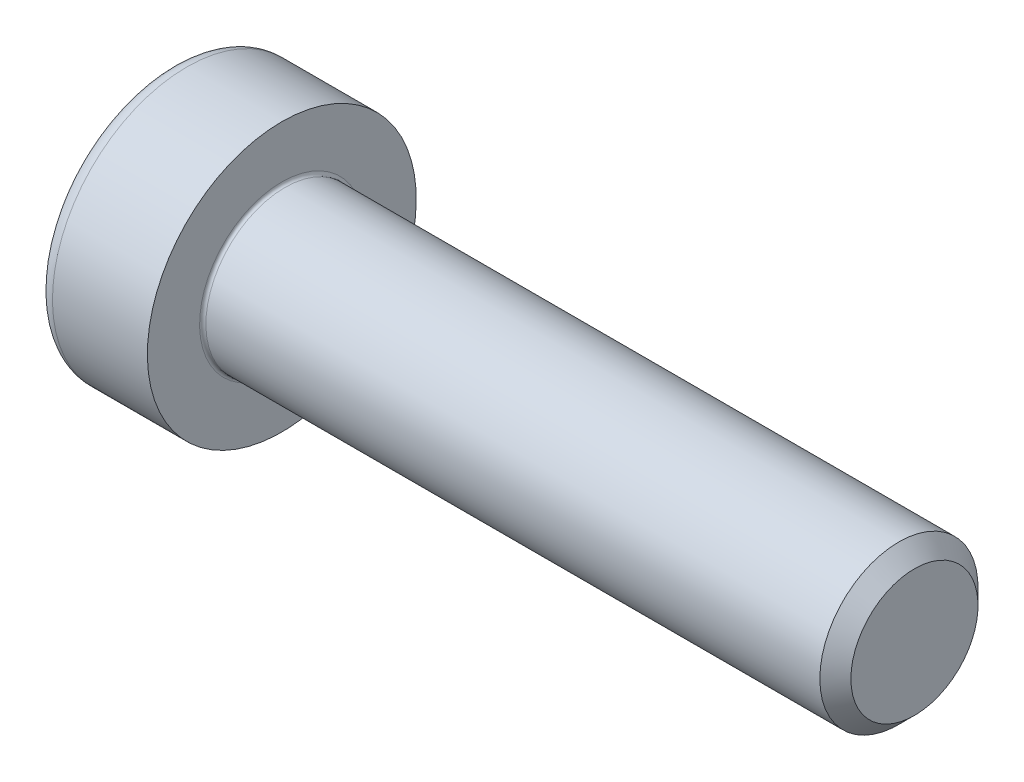
ISO-10303-21;
HEADER;
FILE_DESCRIPTION(('STEP AP214'),'2;1');
FILE_NAME('part.step','',(''),(''),'','','');
FILE_SCHEMA(('AUTOMOTIVE_DESIGN { 1 0 10303 214 1 1 1 1 }'));
ENDSEC;
DATA;
#1=APPLICATION_CONTEXT('core data for automotive mechanical design processes');
#2=APPLICATION_PROTOCOL_DEFINITION('international standard','automotive_design',2000,#1);
#3=PRODUCT_CONTEXT('',#1,'mechanical');
#4=PRODUCT('Part','Part','',(#3));
#5=PRODUCT_RELATED_PRODUCT_CATEGORY('part','',(#4));
#6=PRODUCT_DEFINITION_FORMATION('','',#4);
#7=PRODUCT_DEFINITION_CONTEXT('part definition',#1,'design');
#8=PRODUCT_DEFINITION('design','',#6,#7);
#9=PRODUCT_DEFINITION_SHAPE('','',#8);
#10=(LENGTH_UNIT() NAMED_UNIT(*) SI_UNIT(.MILLI.,.METRE.));
#11=(NAMED_UNIT(*) PLANE_ANGLE_UNIT() SI_UNIT($,.RADIAN.));
#12=(NAMED_UNIT(*) SI_UNIT($,.STERADIAN.) SOLID_ANGLE_UNIT());
#13=UNCERTAINTY_MEASURE_WITH_UNIT(LENGTH_MEASURE(1.E-05),#10,'distance_accuracy_value','');
#14=(GEOMETRIC_REPRESENTATION_CONTEXT(3) GLOBAL_UNCERTAINTY_ASSIGNED_CONTEXT((#13)) GLOBAL_UNIT_ASSIGNED_CONTEXT((#10,
#11,#12)) REPRESENTATION_CONTEXT('',''));
#15=CARTESIAN_POINT('',(0.,0.,0.));
#16=DIRECTION('',(0.,0.,1.));
#17=DIRECTION('',(1.,0.,0.));
#18=AXIS2_PLACEMENT_3D('',#15,#16,#17);
#19=CARTESIAN_POINT('',(-3.5,-1.5,0.866025403784439));
#20=DIRECTION('',(0.,-0.5,0.866025403784439));
#21=DIRECTION('',(0.,-0.866025403784439,-0.5));
#22=AXIS2_PLACEMENT_3D('',#19,#20,#21);
#23=PLANE('',#22);
#24=DIRECTION('',(1.,0.,0.));
#25=VECTOR('',#24,1.);
#26=CARTESIAN_POINT('',(-3.5,-1.5,0.866025403784439));
#27=LINE('',#26,#25);
#28=CARTESIAN_POINT('',(-0.799999985622492,-1.49999995696418,0.866025428631178));
#29=VERTEX_POINT('',#28);
#30=CARTESIAN_POINT('',(-3.5,-1.5,0.866025403784439));
#31=VERTEX_POINT('',#30);
#32=EDGE_CURVE('E80',#29,#31,#27,.F.);
#33=ORIENTED_EDGE('',*,*,#32,.T.);
#34=DIRECTION('',(0.,-0.866025403784439,-0.5));
#35=VECTOR('',#34,1.);
#36=CARTESIAN_POINT('',(-3.5,-1.5,0.866025403784439));
#37=LINE('',#36,#35);
#38=CARTESIAN_POINT('',(-3.5,0.,1.73205080756888));
#39=VERTEX_POINT('',#38);
#40=EDGE_CURVE('E92',#39,#31,#37,.T.);
#41=ORIENTED_EDGE('',*,*,#40,.F.);
#42=DIRECTION('',(1.,0.,0.));
#43=VECTOR('',#42,1.);
#44=CARTESIAN_POINT('',(-3.5,0.,1.73205080756888));
#45=LINE('',#44,#43);
#46=CARTESIAN_POINT('',(-0.799999997599108,7.10597104829765E-09,1.73205080346625));
#47=VERTEX_POINT('',#46);
#48=EDGE_CURVE('E75',#39,#47,#45,.T.);
#49=ORIENTED_EDGE('',*,*,#48,.T.);
#50=CARTESIAN_POINT('',(-0.79999999523045,-1.42119406428362E-08,1.73205079936361));
#51=CARTESIAN_POINT('',(-0.778021654471843,-0.0659159296217296,1.69399422785789));
#52=CARTESIAN_POINT('',(-0.75803350387137,-0.132400830276049,1.65560915256807));
#53=CARTESIAN_POINT('',(-0.723144787463201,-0.266521773143787,1.57817439009942));
#54=CARTESIAN_POINT('',(-0.708256562613242,-0.334160197650871,1.53912332750269));
#55=CARTESIAN_POINT('',(-0.685081967437947,-0.468598837632643,1.46150514251973));
#56=CARTESIAN_POINT('',(-0.676641339355386,-0.535378373795379,1.42294995933981));
#57=CARTESIAN_POINT('',(-0.666566875590512,-0.669251501943533,1.34565827276622));
#58=CARTESIAN_POINT('',(-0.664924695379553,-0.736344607670476,1.306922050114));
#59=CARTESIAN_POINT('',(-0.668349717996245,-0.861700870345308,1.23454757811408));
#60=CARTESIAN_POINT('',(-0.672575963675141,-0.919982838042977,1.20089846837493));
#61=CARTESIAN_POINT('',(-0.685967972738458,-1.03616708549267,1.13381946183425));
#62=CARTESIAN_POINT('',(-0.69513830632732,-1.09406896369459,1.10038979686779));
#63=CARTESIAN_POINT('',(-0.718062365210631,-1.21049256160527,1.03317260127403));
#64=CARTESIAN_POINT('',(-0.731913218734013,-1.26899955377542,0.999393573595124));
#65=CARTESIAN_POINT('',(-0.763348800641441,-1.38514115888167,0.932339186622913));
#66=CARTESIAN_POINT('',(-0.780926147658833,-1.44277725857737,0.899062968948563));
#67=CARTESIAN_POINT('',(-0.799999971939572,-1.49999991591542,0.866025452330692));
#68=B_SPLINE_CURVE_WITH_KNOTS('',3,(#50,#51,#52,#53,#54,#55,#56,#57,#58,#59,#60,#61,#62,#63,#64,
#65,#66,#67),.UNSPECIFIED.,.F.,.F.,(4,2,2,2,2,2,2,2,4),(0.,0.237762007462697,0.476095360319202,
0.708530701230582,0.940680662376141,1.14278080497742,1.34506808554704,1.5518411278147,
1.75820836205007),.UNSPECIFIED.);
#69=EDGE_CURVE('E20',#47,#29,#68,.T.);
#70=ORIENTED_EDGE('',*,*,#69,.T.);
#71=EDGE_LOOP('',(#33,#41,#49,#70));
#72=FACE_BOUND('',#71,.T.);
#73=ADVANCED_FACE('F16',(#72),#23,.F.);
#74=CARTESIAN_POINT('',(-3.5,-1.5,-0.866025403784438));
#75=DIRECTION('',(0.,-1.,0.));
#76=DIRECTION('',(0.,0.,-1.));
#77=AXIS2_PLACEMENT_3D('',#74,#75,#76);
#78=PLANE('',#77);
#79=DIRECTION('',(1.,0.,0.));
#80=VECTOR('',#79,1.);
#81=CARTESIAN_POINT('',(-3.5,-1.5,-0.866025403784441));
#82=LINE('',#81,#80);
#83=CARTESIAN_POINT('',(-0.799999985618856,-1.5,-0.866025354078363));
#84=VERTEX_POINT('',#83);
#85=CARTESIAN_POINT('',(-3.5,-1.5,-0.86602540378444));
#86=VERTEX_POINT('',#85);
#87=EDGE_CURVE('E256',#84,#86,#82,.F.);
#88=ORIENTED_EDGE('',*,*,#87,.T.);
#89=DIRECTION('',(0.,0.,-1.));
#90=VECTOR('',#89,1.);
#91=CARTESIAN_POINT('',(-3.5,-1.5,-0.866025403784438));
#92=LINE('',#91,#90);
#93=EDGE_CURVE('E91',#31,#86,#92,.T.);
#94=ORIENTED_EDGE('',*,*,#93,.F.);
#95=ORIENTED_EDGE('',*,*,#32,.F.);
#96=CARTESIAN_POINT('',(-0.80000001920407,-1.5,0.866025470420961));
#97=CARTESIAN_POINT('',(-0.77802167648407,-1.5,0.789912326035068));
#98=CARTESIAN_POINT('',(-0.758033523798478,-1.5,0.71314217407231));
#99=CARTESIAN_POINT('',(-0.72314480305895,-1.5,0.558272646234354));
#100=CARTESIAN_POINT('',(-0.708256575965243,-1.5,0.480170519522534));
#101=CARTESIAN_POINT('',(-0.685081976339449,-1.5,0.324934146522609));
#102=CARTESIAN_POINT('',(-0.676641346041333,-1.5,0.247823778652587));
#103=CARTESIAN_POINT('',(-0.666566877999529,-1.5,0.093240402308305));
#104=CARTESIAN_POINT('',(-0.664924695725613,-1.5,0.0157679553172992));
#105=CARTESIAN_POINT('',(-0.668349714916898,-1.5,-0.128980995732178));
#106=CARTESIAN_POINT('',(-0.672575959480538,-1.5,-0.1962792205453));
#107=CARTESIAN_POINT('',(-0.685967967205766,-1.5,-0.330437244313667));
#108=CARTESIAN_POINT('',(-0.695138300573747,-1.5,-0.39729657959867));
#109=CARTESIAN_POINT('',(-0.718062359838272,-1.5,-0.531730981680734));
#110=CARTESIAN_POINT('',(-0.731913213992538,-1.5,-0.599289042577003));
#111=CARTESIAN_POINT('',(-0.763348797820156,-1.5,-0.733397827427737));
#112=CARTESIAN_POINT('',(-0.780926146124214,-1.5,-0.799950268144878));
#113=CARTESIAN_POINT('',(-0.799999971931643,-1.5,-0.866025306664466));
#114=B_SPLINE_CURVE_WITH_KNOTS('',3,(#96,#97,#98,#99,#100,#101,#102,#103,#104,#105,#106,#107,
#108,#109,#110,#111,#112,#113),.UNSPECIFIED.,.F.,.F.,(4,2,2,2,2,2,2,2,4),(0.,0.237762013064718,
0.476095371668162,0.708530717807786,0.940680684127374,1.14278084243753,1.34506813877668,
1.55184119766869,1.75820844842222),.UNSPECIFIED.);
#115=EDGE_CURVE('E85',#29,#84,#114,.T.);
#116=ORIENTED_EDGE('',*,*,#115,.T.);
#117=EDGE_LOOP('',(#88,#94,#95,#116));
#118=FACE_BOUND('',#117,.T.);
#119=ADVANCED_FACE('F89',(#118),#78,.F.);
#120=CARTESIAN_POINT('',(-3.5,0.,1.73205080756888));
#121=DIRECTION('',(0.,0.500000000000001,0.866025403784438));
#122=DIRECTION('',(0.,-0.866025403784438,0.500000000000001));
#123=AXIS2_PLACEMENT_3D('',#120,#121,#122);
#124=PLANE('',#123);
#125=ORIENTED_EDGE('',*,*,#48,.F.);
#126=DIRECTION('',(0.,-0.866025403784438,0.500000000000001));
#127=VECTOR('',#126,1.);
#128=CARTESIAN_POINT('',(-3.5,0.,1.73205080756888));
#129=LINE('',#128,#127);
#130=CARTESIAN_POINT('',(-3.5,1.5,0.866025403784438));
#131=VERTEX_POINT('',#130);
#132=EDGE_CURVE('E264',#131,#39,#129,.T.);
#133=ORIENTED_EDGE('',*,*,#132,.F.);
#134=DIRECTION('',(1.,0.,0.));
#135=VECTOR('',#134,1.);
#136=CARTESIAN_POINT('',(-3.5,1.5,0.866025403784437));
#137=LINE('',#136,#135);
#138=CARTESIAN_POINT('',(-0.799999985618081,1.5,0.86602535407568));
#139=VERTEX_POINT('',#138);
#140=EDGE_CURVE('E86',#131,#139,#137,.T.);
#141=ORIENTED_EDGE('',*,*,#140,.T.);
#142=CARTESIAN_POINT('',(-0.800000019200306,1.50000005769763,0.866025370472699));
#143=CARTESIAN_POINT('',(-0.778021676473136,1.434084141075,0.904081942678651));
#144=CARTESIAN_POINT('',(-0.758033523781653,1.36759923920006,0.942467018673197));
#145=CARTESIAN_POINT('',(-0.723144803033518,1.23347829377109,1.01990178262058));
#146=CARTESIAN_POINT('',(-0.708256575937328,1.16583986792264,1.05895284599175));
#147=CARTESIAN_POINT('',(-0.685081976321015,1.03140122530974,1.13657103249379));
#148=CARTESIAN_POINT('',(-0.676641346030252,0.96462168786259,1.17512621641526));
#149=CARTESIAN_POINT('',(-0.666566877997534,0.830748556996803,1.25241790455788));
#150=CARTESIAN_POINT('',(-0.664924695725133,0.763655449836942,1.2911541280374));
#151=CARTESIAN_POINT('',(-0.668349715079621,0.638299175179464,1.3635286069555));
#152=CARTESIAN_POINT('',(-0.672575960339688,0.580017196969192,1.3971777227641));
#153=CARTESIAN_POINT('',(-0.685967970415505,0.463832928577172,1.46425674139584));
#154=CARTESIAN_POINT('',(-0.695138305439918,0.405931039945865,1.49768641238371));
#155=CARTESIAN_POINT('',(-0.718062368834513,0.289507420877407,1.56490362019291));
#156=CARTESIAN_POINT('',(-0.731913225492328,0.231000417988109,1.59868265406053));
#157=CARTESIAN_POINT('',(-0.763348814871443,0.114858791806787,1.66573705320044));
#158=CARTESIAN_POINT('',(-0.780926166220136,0.0572226817538924,1.69901327685452));
#159=CARTESIAN_POINT('',(-0.799999995230451,1.4211942059671E-08,1.73205079936361));
#160=B_SPLINE_CURVE_WITH_KNOTS('',3,(#142,#143,#144,#145,#146,#147,#148,#149,#150,#151,#152,
#153,#154,#155,#156,#157,#158,#159),.UNSPECIFIED.,.F.,.F.,(4,2,2,2,2,2,2,2,4),(0.,
0.237762013145497,0.476095371840186,0.708530717895911,0.940680684123999,1.14278086287541,
1.34506817973146,1.55184126020577,1.75820853237728),.UNSPECIFIED.);
#161=EDGE_CURVE('E124',#139,#47,#160,.T.);
#162=ORIENTED_EDGE('',*,*,#161,.T.);
#163=EDGE_LOOP('',(#125,#133,#141,#162));
#164=FACE_BOUND('',#163,.T.);
#165=ADVANCED_FACE('F117',(#164),#124,.F.);
#166=CARTESIAN_POINT('',(-3.5,0.,-1.73205080756888));
#167=DIRECTION('',(0.,-0.5,-0.866025403784439));
#168=DIRECTION('',(0.,0.866025403784439,-0.5));
#169=AXIS2_PLACEMENT_3D('',#166,#167,#168);
#170=PLANE('',#169);
#171=DIRECTION('',(1.,0.,0.));
#172=VECTOR('',#171,1.);
#173=CARTESIAN_POINT('',(-3.5,0.,-1.73205080756888));
#174=LINE('',#173,#172);
#175=CARTESIAN_POINT('',(-0.79999999228092,-5.19199616255216E-08,-1.73205079425487));
#176=VERTEX_POINT('',#175);
#177=CARTESIAN_POINT('',(-3.5,0.,-1.73205080756888));
#178=VERTEX_POINT('',#177);
#179=EDGE_CURVE('E130',#176,#178,#174,.F.);
#180=ORIENTED_EDGE('',*,*,#179,.T.);
#181=DIRECTION('',(0.,0.866025403784439,-0.5));
#182=VECTOR('',#181,1.);
#183=CARTESIAN_POINT('',(-3.5,0.,-1.73205080756888));
#184=LINE('',#183,#182);
#185=EDGE_CURVE('E40',#86,#178,#184,.T.);
#186=ORIENTED_EDGE('',*,*,#185,.F.);
#187=ORIENTED_EDGE('',*,*,#87,.F.);
#188=CARTESIAN_POINT('',(-0.80000001919876,-1.50000005769299,-0.866025370475382));
#189=CARTESIAN_POINT('',(-0.778021676478217,-1.43408414109019,-0.904081942669888));
#190=CARTESIAN_POINT('',(-0.758033523792275,-1.36759923923531,-0.942467018652848));
#191=CARTESIAN_POINT('',(-0.723144803052494,-1.23347829384962,-1.01990178257524));
#192=CARTESIAN_POINT('',(-0.708256575958914,-1.1658398680244,-1.05895284593299));
#193=CARTESIAN_POINT('',(-0.685081976335253,-1.03140122541517,-1.13657103243292));
#194=CARTESIAN_POINT('',(-0.676641346038543,-0.964621687947892,-1.17512621636601));
#195=CARTESIAN_POINT('',(-0.666566877998786,-0.830748557038207,-1.25241790453398));
#196=CARTESIAN_POINT('',(-0.664924695725483,-0.763655449854563,-1.29115412802722));
#197=CARTESIAN_POINT('',(-0.668349714938769,-0.638299180308243,-1.3635286039944));
#198=CARTESIAN_POINT('',(-0.672575959593581,-0.580017207221899,-1.3971777168447));
#199=CARTESIAN_POINT('',(-0.685967967626045,-0.463832948992601,-1.46425672960898));
#200=CARTESIAN_POINT('',(-0.695138301210387,-0.405931065399885,-1.49768639768783));
#201=CARTESIAN_POINT('',(-0.718062361014188,-0.289507456525241,-1.56490359961163));
#202=CARTESIAN_POINT('',(-0.731913215495269,-0.231000458786164,-1.59868263050576));
#203=CARTESIAN_POINT('',(-0.763348800047481,-0.114858842717895,-1.66573702380689));
#204=CARTESIAN_POINT('',(-0.780926148748883,-0.0572227376285118,-1.69901324459529));
#205=CARTESIAN_POINT('',(-0.799999974974276,-7.49804696541984E-08,-1.73205076427889));
#206=B_SPLINE_CURVE_WITH_KNOTS('',3,(#188,#189,#190,#191,#192,#193,#194,#195,#196,#197,#198,
#199,#200,#201,#202,#203,#204,#205),.UNSPECIFIED.,.F.,.F.,(4,2,2,2,2,2,2,2,4),(0.,
0.237762013074141,0.476095371688346,0.708530717815962,0.940680684122561,1.14278084509901,
1.34506814411433,1.55184120582146,1.75820845936868),.UNSPECIFIED.);
#207=EDGE_CURVE('E98',#84,#176,#206,.T.);
#208=ORIENTED_EDGE('',*,*,#207,.T.);
#209=EDGE_LOOP('',(#180,#186,#187,#208));
#210=FACE_BOUND('',#209,.T.);
#211=ADVANCED_FACE('F120',(#210),#170,.F.);
#212=CARTESIAN_POINT('',(-3.5,1.5,0.866025403784437));
#213=DIRECTION('',(0.,1.,0.));
#214=DIRECTION('',(0.,0.,1.));
#215=AXIS2_PLACEMENT_3D('',#212,#213,#214);
#216=PLANE('',#215);
#217=ORIENTED_EDGE('',*,*,#140,.F.);
#218=DIRECTION('',(0.,0.,1.));
#219=VECTOR('',#218,1.);
#220=CARTESIAN_POINT('',(-3.5,1.5,0.866025403784437));
#221=LINE('',#220,#219);
#222=CARTESIAN_POINT('',(-3.5,1.5,-0.86602540378444));
#223=VERTEX_POINT('',#222);
#224=EDGE_CURVE('E246',#223,#131,#221,.T.);
#225=ORIENTED_EDGE('',*,*,#224,.F.);
#226=DIRECTION('',(1.,0.,0.));
#227=VECTOR('',#226,1.);
#228=CARTESIAN_POINT('',(-3.5,1.5,-0.86602540378444));
#229=LINE('',#228,#227);
#230=CARTESIAN_POINT('',(-0.800000004773855,1.5,-0.866025420433232));
#231=VERTEX_POINT('',#230);
#232=EDGE_CURVE('E233',#223,#231,#229,.T.);
#233=ORIENTED_EDGE('',*,*,#232,.T.);
#234=CARTESIAN_POINT('',(-0.800000009579947,1.5,-0.866025437082024));
#235=CARTESIAN_POINT('',(-0.778021667647342,1.5,-0.789912293247904));
#236=CARTESIAN_POINT('',(-0.758033515798816,1.5,-0.713142141840401));
#237=CARTESIAN_POINT('',(-0.723144796798097,1.5,-0.558272615166911));
#238=CARTESIAN_POINT('',(-0.708256570605135,1.5,-0.480170489064639));
#239=CARTESIAN_POINT('',(-0.685081972765976,1.5,-0.324934117282703));
#240=CARTESIAN_POINT('',(-0.676641343357286,1.5,-0.247823750018937));
#241=CARTESIAN_POINT('',(-0.666566877032438,1.5,-0.0932403749581056));
#242=CARTESIAN_POINT('',(-0.664924695586688,1.5,-0.0157679286441603));
#243=CARTESIAN_POINT('',(-0.668349716153057,1.5,0.12898101957391));
#244=CARTESIAN_POINT('',(-0.672575961164274,1.5,0.196279242244028));
#245=CARTESIAN_POINT('',(-0.685967969426204,1.5,0.330437261719437));
#246=CARTESIAN_POINT('',(-0.695138302882526,1.5,0.397296594854532));
#247=CARTESIAN_POINT('',(-0.718062361993189,1.5,0.531730992560314));
#248=CARTESIAN_POINT('',(-0.731913215893689,1.5,0.599289051231826));
#249=CARTESIAN_POINT('',(-0.763348798949344,1.5,0.733397831701578));
#250=CARTESIAN_POINT('',(-0.780926146736267,1.5,0.799950270262262));
#251=CARTESIAN_POINT('',(-0.799999971930172,1.5,0.866025306659371));
#252=B_SPLINE_CURVE_WITH_KNOTS('',3,(#234,#235,#236,#237,#238,#239,#240,#241,#242,#243,#244,
#245,#246,#247,#248,#249,#250,#251),.UNSPECIFIED.,.F.,.F.,(4,2,2,2,2,2,2,2,4),(0.,
0.237762010815791,0.476095367112129,0.708530711152909,0.94068067539542,1.14278082739522,
1.34506811739966,1.55184116961357,1.75820841373167),.UNSPECIFIED.);
#253=EDGE_CURVE('E99',#231,#139,#252,.T.);
#254=ORIENTED_EDGE('',*,*,#253,.T.);
#255=EDGE_LOOP('',(#217,#225,#233,#254));
#256=FACE_BOUND('',#255,.T.);
#257=ADVANCED_FACE('F142',(#256),#216,.F.);
#258=CARTESIAN_POINT('',(-0.805999999954565,0.,0.));
#259=DIRECTION('',(-1.,0.,0.));
#260=DIRECTION('',(0.,0.,1.));
#261=AXIS2_PLACEMENT_3D('',#258,#259,#260);
#262=CONICAL_SURFACE('',#261,1.74244311239136,1.04719755119347);
#263=CARTESIAN_POINT('',(0.200000000006639,5.6843418860808E-11,0.));
#264=VERTEX_POINT('',#263);
#265=VERTEX_LOOP('',#264);
#266=FACE_BOUND('',#265,.T.);
#267=ORIENTED_EDGE('',*,*,#253,.F.);
#268=CARTESIAN_POINT('',(-0.799999987565332,1.49999999829359,-0.866025421405676));
#269=CARTESIAN_POINT('',(-0.778021652564251,1.43408407762085,-0.904081985288844));
#270=CARTESIAN_POINT('',(-0.758033504356687,1.3675991751805,-0.942467057236285));
#271=CARTESIAN_POINT('',(-0.723144789665911,1.23347823172278,-1.01990181683896));
#272=CARTESIAN_POINT('',(-0.708256564139788,1.16583980841784,-1.0589528799219));
#273=CARTESIAN_POINT('',(-0.685081968277446,1.03140116995321,-1.13657106486834));
#274=CARTESIAN_POINT('',(-0.676641340171225,0.964621634125293,-1.17512624755098));
#275=CARTESIAN_POINT('',(-0.666566876035965,0.830748506885492,-1.25241793337932));
#276=CARTESIAN_POINT('',(-0.664924695474804,0.763655401732061,-1.29115415578309));
#277=CARTESIAN_POINT('',(-0.668349717701065,0.638299129211433,-1.36352863351924));
#278=CARTESIAN_POINT('',(-0.672575964320524,0.580017151128484,-1.39717774923674));
#279=CARTESIAN_POINT('',(-0.685967976967149,0.463832883057317,-1.46425676767024));
#280=CARTESIAN_POINT('',(-0.695138313204424,0.405930994619759,-1.49768643855087));
#281=CARTESIAN_POINT('',(-0.718062378844989,0.289507376071707,-1.56490364606341));
#282=CARTESIAN_POINT('',(-0.731913236524521,0.231000373508745,-1.59868267974166));
#283=CARTESIAN_POINT('',(-0.76334882772896,0.114858748018011,-1.66573707848094));
#284=CARTESIAN_POINT('',(-0.780926179879627,0.057222638328946,-1.69901330192401));
#285=CARTESIAN_POINT('',(-0.800000009587573,-2.88594275326849E-08,-1.73205082423088));
#286=B_SPLINE_CURVE_WITH_KNOTS('',3,(#268,#269,#270,#271,#272,#273,#274,#275,#276,#277,#278,
#279,#280,#281,#282,#283,#284,#285),.UNSPECIFIED.,.F.,.F.,(4,2,2,2,2,2,2,2,4),(0.,
0.237762005317704,0.476095356332995,0.708530695581587,0.940680654933745,1.14278083347123,
1.34506815017807,1.55184123017011,1.75820850174807),.UNSPECIFIED.);
#287=EDGE_CURVE('E131',#231,#176,#286,.T.);
#288=ORIENTED_EDGE('',*,*,#287,.T.);
#289=ORIENTED_EDGE('',*,*,#207,.F.);
#290=ORIENTED_EDGE('',*,*,#115,.F.);
#291=ORIENTED_EDGE('',*,*,#69,.F.);
#292=ORIENTED_EDGE('',*,*,#161,.F.);
#293=EDGE_LOOP('',(#267,#288,#289,#290,#291,#292));
#294=FACE_BOUND('',#293,.T.);
#295=ADVANCED_FACE('F96',(#266,#294),#262,.F.);
#296=CARTESIAN_POINT('',(-3.5,1.5,-0.86602540378444));
#297=DIRECTION('',(0.,0.5,-0.866025403784439));
#298=DIRECTION('',(0.,0.866025403784439,0.5));
#299=AXIS2_PLACEMENT_3D('',#296,#297,#298);
#300=PLANE('',#299);
#301=ORIENTED_EDGE('',*,*,#232,.F.);
#302=DIRECTION('',(0.,0.866025403784438,0.5));
#303=VECTOR('',#302,1.);
#304=CARTESIAN_POINT('',(-3.5,0.,-1.73205080756888));
#305=LINE('',#304,#303);
#306=EDGE_CURVE('E252',#178,#223,#305,.T.);
#307=ORIENTED_EDGE('',*,*,#306,.F.);
#308=ORIENTED_EDGE('',*,*,#179,.F.);
#309=ORIENTED_EDGE('',*,*,#287,.F.);
#310=EDGE_LOOP('',(#301,#307,#308,#309));
#311=FACE_BOUND('',#310,.T.);
#312=ADVANCED_FACE('F151',(#311),#300,.F.);
#313=CARTESIAN_POINT('',(-3.5,2.99102540378444,0.));
#314=DIRECTION('',(-1.,0.,0.));
#315=DIRECTION('',(0.,-1.,0.));
#316=AXIS2_PLACEMENT_3D('',#313,#314,#315);
#317=PLANE('',#316);
#318=ORIENTED_EDGE('',*,*,#185,.T.);
#319=ORIENTED_EDGE('',*,*,#306,.T.);
#320=ORIENTED_EDGE('',*,*,#224,.T.);
#321=ORIENTED_EDGE('',*,*,#132,.T.);
#322=ORIENTED_EDGE('',*,*,#40,.T.);
#323=ORIENTED_EDGE('',*,*,#93,.T.);
#324=EDGE_LOOP('',(#318,#319,#320,#321,#322,#323));
#325=FACE_BOUND('',#324,.T.);
#326=CARTESIAN_POINT('',(-3.5,0.,0.));
#327=DIRECTION('',(1.,0.,0.));
#328=DIRECTION('',(0.,1.,0.));
#329=AXIS2_PLACEMENT_3D('',#326,#327,#328);
#330=CIRCLE('',#329,3.75);
#331=CARTESIAN_POINT('',(-3.5,3.75,0.));
#332=VERTEX_POINT('',#331);
#333=EDGE_CURVE('E220',#332,#332,#330,.T.);
#334=ORIENTED_EDGE('',*,*,#333,.F.);
#335=EDGE_LOOP('',(#334));
#336=FACE_BOUND('',#335,.T.);
#337=ADVANCED_FACE('F207',(#325,#336),#317,.T.);
#338=CARTESIAN_POINT('',(-3.,0.,0.));
#339=DIRECTION('',(1.,0.,0.));
#340=DIRECTION('',(0.,0.,-1.));
#341=AXIS2_PLACEMENT_3D('',#338,#339,#340);
#342=TOROIDAL_SURFACE('',#341,3.75,0.5);
#343=CARTESIAN_POINT('',(-3.,0.,0.));
#344=DIRECTION('',(1.,0.,0.));
#345=DIRECTION('',(0.,1.,0.));
#346=AXIS2_PLACEMENT_3D('',#343,#344,#345);
#347=CIRCLE('',#346,4.25);
#348=CARTESIAN_POINT('',(-3.,4.25,0.));
#349=VERTEX_POINT('',#348);
#350=EDGE_CURVE('E285',#349,#349,#347,.T.);
#351=ORIENTED_EDGE('',*,*,#350,.F.);
#352=EDGE_LOOP('',(#351));
#353=FACE_BOUND('',#352,.T.);
#354=ORIENTED_EDGE('',*,*,#333,.T.);
#355=EDGE_LOOP('',(#354));
#356=FACE_BOUND('',#355,.T.);
#357=ADVANCED_FACE('F201',(#353,#356),#342,.T.);
#358=CARTESIAN_POINT('',(-1.75,0.,0.));
#359=DIRECTION('',(1.,0.,0.));
#360=DIRECTION('',(0.,1.,0.));
#361=AXIS2_PLACEMENT_3D('',#358,#359,#360);
#362=CYLINDRICAL_SURFACE('',#361,4.25);
#363=ORIENTED_EDGE('',*,*,#350,.T.);
#364=EDGE_LOOP('',(#363));
#365=FACE_BOUND('',#364,.T.);
#366=CARTESIAN_POINT('',(0.,0.,0.));
#367=DIRECTION('',(1.,0.,0.));
#368=DIRECTION('',(0.,1.,0.));
#369=AXIS2_PLACEMENT_3D('',#366,#367,#368);
#370=CIRCLE('',#369,4.25);
#371=CARTESIAN_POINT('',(0.,4.25,0.));
#372=VERTEX_POINT('',#371);
#373=EDGE_CURVE('E281',#372,#372,#370,.T.);
#374=ORIENTED_EDGE('',*,*,#373,.F.);
#375=EDGE_LOOP('',(#374));
#376=FACE_BOUND('',#375,.T.);
#377=ADVANCED_FACE('F197',(#365,#376),#362,.T.);
#378=CARTESIAN_POINT('',(20.,1.25,0.));
#379=DIRECTION('',(1.,0.,0.));
#380=DIRECTION('',(0.,1.,0.));
#381=AXIS2_PLACEMENT_3D('',#378,#379,#380);
#382=PLANE('',#381);
#383=CARTESIAN_POINT('',(19.9999999999818,0.,0.));
#384=DIRECTION('',(-1.,0.,0.));
#385=DIRECTION('',(0.,0.,1.));
#386=AXIS2_PLACEMENT_3D('',#383,#384,#385);
#387=CIRCLE('',#386,2.00924000006353);
#388=CARTESIAN_POINT('',(19.9999999999818,0.,2.00924000006353));
#389=VERTEX_POINT('',#388);
#390=EDGE_CURVE('E278',#389,#389,#387,.T.);
#391=ORIENTED_EDGE('',*,*,#390,.F.);
#392=EDGE_LOOP('',(#391));
#393=FACE_BOUND('',#392,.T.);
#394=ADVANCED_FACE('F194',(#393),#382,.T.);
#395=CARTESIAN_POINT('',(0.,3.375,0.));
#396=DIRECTION('',(1.,0.,0.));
#397=DIRECTION('',(0.,1.,0.));
#398=AXIS2_PLACEMENT_3D('',#395,#396,#397);
#399=PLANE('',#398);
#400=CARTESIAN_POINT('',(0.,0.,0.));
#401=DIRECTION('',(1.,0.,0.));
#402=DIRECTION('',(0.,1.,0.));
#403=AXIS2_PLACEMENT_3D('',#400,#401,#402);
#404=CIRCLE('',#403,2.6);
#405=CARTESIAN_POINT('',(0.,2.6,0.));
#406=VERTEX_POINT('',#405);
#407=EDGE_CURVE('E181',#406,#406,#404,.F.);
#408=ORIENTED_EDGE('',*,*,#407,.T.);
#409=EDGE_LOOP('',(#408));
#410=FACE_BOUND('',#409,.T.);
#411=ORIENTED_EDGE('',*,*,#373,.T.);
#412=EDGE_LOOP('',(#411));
#413=FACE_BOUND('',#412,.T.);
#414=ADVANCED_FACE('F185',(#410,#413),#399,.T.);
#415=CARTESIAN_POINT('',(19.5092399999339,0.,0.));
#416=DIRECTION('',(-1.,0.,0.));
#417=DIRECTION('',(0.,0.,1.));
#418=AXIS2_PLACEMENT_3D('',#415,#416,#417);
#419=CONICAL_SURFACE('',#418,2.50000000011141,0.785398163397448);
#420=ORIENTED_EDGE('',*,*,#390,.T.);
#421=EDGE_LOOP('',(#420));
#422=FACE_BOUND('',#421,.T.);
#423=CARTESIAN_POINT('',(19.50924,0.,0.));
#424=DIRECTION('',(1.,0.,0.));
#425=DIRECTION('',(0.,1.,0.));
#426=AXIS2_PLACEMENT_3D('',#423,#424,#425);
#427=CIRCLE('',#426,2.5);
#428=CARTESIAN_POINT('',(19.50924,2.5,0.));
#429=VERTEX_POINT('',#428);
#430=EDGE_CURVE('E31',#429,#429,#427,.F.);
#431=ORIENTED_EDGE('',*,*,#430,.F.);
#432=EDGE_LOOP('',(#431));
#433=FACE_BOUND('',#432,.T.);
#434=ADVANCED_FACE('F163',(#422,#433),#419,.T.);
#435=CARTESIAN_POINT('',(0.100000000000002,0.,0.));
#436=DIRECTION('',(1.,0.,0.));
#437=DIRECTION('',(0.,0.,-1.));
#438=AXIS2_PLACEMENT_3D('',#435,#436,#437);
#439=TOROIDAL_SURFACE('',#438,2.6,0.1);
#440=CARTESIAN_POINT('',(0.100000000000003,0.,0.));
#441=DIRECTION('',(1.,0.,0.));
#442=DIRECTION('',(0.,1.,0.));
#443=AXIS2_PLACEMENT_3D('',#440,#441,#442);
#444=CIRCLE('',#443,2.5);
#445=CARTESIAN_POINT('',(0.100000000000003,2.5,0.));
#446=VERTEX_POINT('',#445);
#447=EDGE_CURVE('E11',#446,#446,#444,.T.);
#448=ORIENTED_EDGE('',*,*,#447,.F.);
#449=EDGE_LOOP('',(#448));
#450=FACE_BOUND('',#449,.T.);
#451=ORIENTED_EDGE('',*,*,#407,.F.);
#452=EDGE_LOOP('',(#451));
#453=FACE_BOUND('',#452,.T.);
#454=ADVANCED_FACE('F157',(#450,#453),#439,.F.);
#455=CARTESIAN_POINT('',(11.2,0.,0.));
#456=DIRECTION('',(1.,0.,0.));
#457=DIRECTION('',(0.,1.,0.));
#458=AXIS2_PLACEMENT_3D('',#455,#456,#457);
#459=CYLINDRICAL_SURFACE('',#458,2.5);
#460=ORIENTED_EDGE('',*,*,#447,.T.);
#461=EDGE_LOOP('',(#460));
#462=FACE_BOUND('',#461,.T.);
#463=ORIENTED_EDGE('',*,*,#430,.T.);
#464=EDGE_LOOP('',(#463));
#465=FACE_BOUND('',#464,.T.);
#466=ADVANCED_FACE('F155',(#462,#465),#459,.T.);
#467=CLOSED_SHELL('',(#73,#119,#165,#211,#257,#295,#312,#337,#357,#377,#394,#414,#434,#454,#466));
#468=MANIFOLD_SOLID_BREP('B1',#467);
#469=ADVANCED_BREP_SHAPE_REPRESENTATION('',(#18,#468),#14);
#470=SHAPE_DEFINITION_REPRESENTATION(#9,#469);
ENDSEC;
END-ISO-10303-21;
